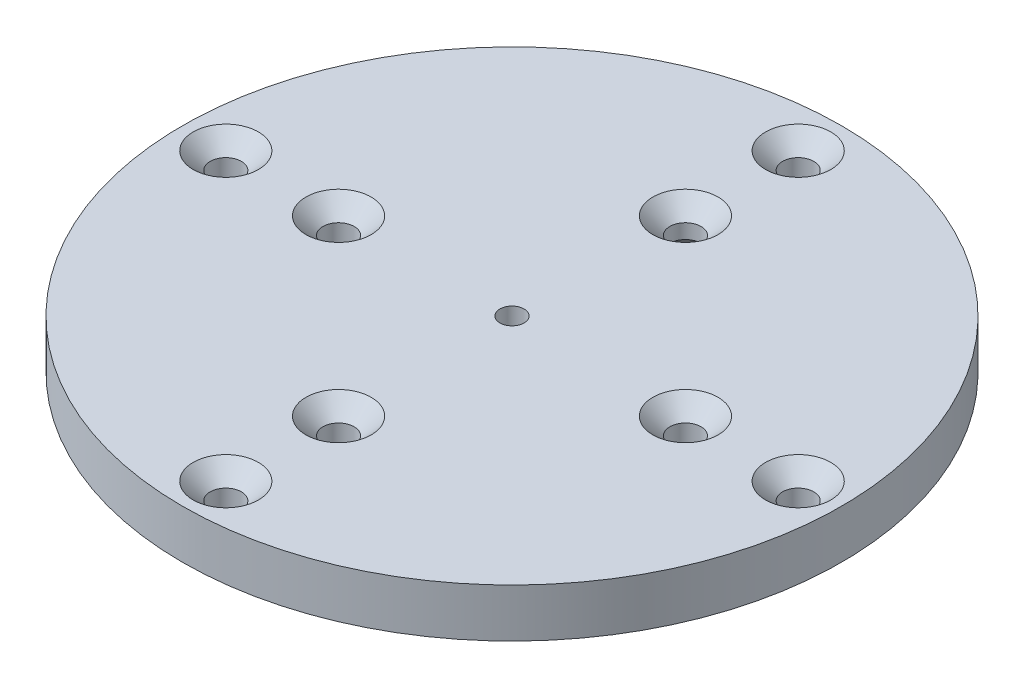
ISO-10303-21;
HEADER;
FILE_DESCRIPTION(('STEP AP214'),'2;1');
FILE_NAME('part.step','',(''),(''),'','','');
FILE_SCHEMA(('AUTOMOTIVE_DESIGN { 1 0 10303 214 1 1 1 1 }'));
ENDSEC;
DATA;
#1=APPLICATION_CONTEXT('core data for automotive mechanical design processes');
#2=APPLICATION_PROTOCOL_DEFINITION('international standard','automotive_design',2000,#1);
#3=PRODUCT_CONTEXT('',#1,'mechanical');
#4=PRODUCT('Part','Part','',(#3));
#5=PRODUCT_RELATED_PRODUCT_CATEGORY('part','',(#4));
#6=PRODUCT_DEFINITION_FORMATION('','',#4);
#7=PRODUCT_DEFINITION_CONTEXT('part definition',#1,'design');
#8=PRODUCT_DEFINITION('design','',#6,#7);
#9=PRODUCT_DEFINITION_SHAPE('','',#8);
#10=(LENGTH_UNIT() NAMED_UNIT(*) SI_UNIT(.MILLI.,.METRE.));
#11=(NAMED_UNIT(*) PLANE_ANGLE_UNIT() SI_UNIT($,.RADIAN.));
#12=(NAMED_UNIT(*) SI_UNIT($,.STERADIAN.) SOLID_ANGLE_UNIT());
#13=UNCERTAINTY_MEASURE_WITH_UNIT(LENGTH_MEASURE(1.E-05),#10,'distance_accuracy_value','');
#14=(GEOMETRIC_REPRESENTATION_CONTEXT(3) GLOBAL_UNCERTAINTY_ASSIGNED_CONTEXT((#13)) GLOBAL_UNIT_ASSIGNED_CONTEXT((#10,
#11,#12)) REPRESENTATION_CONTEXT('',''));
#15=CARTESIAN_POINT('',(0.,0.,0.));
#16=DIRECTION('',(0.,0.,1.));
#17=DIRECTION('',(1.,0.,0.));
#18=AXIS2_PLACEMENT_3D('',#15,#16,#17);
#19=CARTESIAN_POINT('',(0.,7.,0.));
#20=DIRECTION('',(0.,1.,0.));
#21=DIRECTION('',(0.,0.,1.));
#22=AXIS2_PLACEMENT_3D('',#19,#20,#21);
#23=PLANE('',#22);
#24=CARTESIAN_POINT('',(-25.,7.,0.));
#25=DIRECTION('',(0.,1.,0.));
#26=DIRECTION('',(0.,0.,1.));
#27=AXIS2_PLACEMENT_3D('',#24,#25,#26);
#28=CIRCLE('',#27,4.7);
#29=CARTESIAN_POINT('',(-25.,7.,4.7));
#30=VERTEX_POINT('',#29);
#31=EDGE_CURVE('E150',#30,#30,#28,.T.);
#32=ORIENTED_EDGE('',*,*,#31,.F.);
#33=EDGE_LOOP('',(#32));
#34=FACE_BOUND('',#33,.T.);
#35=CARTESIAN_POINT('',(0.,7.,25.));
#36=DIRECTION('',(0.,1.,0.));
#37=DIRECTION('',(0.,0.,1.));
#38=AXIS2_PLACEMENT_3D('',#35,#36,#37);
#39=CIRCLE('',#38,4.7);
#40=CARTESIAN_POINT('',(0.,7.,29.7));
#41=VERTEX_POINT('',#40);
#42=EDGE_CURVE('E138',#41,#41,#39,.T.);
#43=ORIENTED_EDGE('',*,*,#42,.F.);
#44=EDGE_LOOP('',(#43));
#45=FACE_BOUND('',#44,.T.);
#46=CARTESIAN_POINT('',(25.,7.,0.));
#47=DIRECTION('',(0.,1.,0.));
#48=DIRECTION('',(0.,0.,1.));
#49=AXIS2_PLACEMENT_3D('',#46,#47,#48);
#50=CIRCLE('',#49,4.7);
#51=CARTESIAN_POINT('',(25.,7.,4.7));
#52=VERTEX_POINT('',#51);
#53=EDGE_CURVE('E126',#52,#52,#50,.T.);
#54=ORIENTED_EDGE('',*,*,#53,.F.);
#55=EDGE_LOOP('',(#54));
#56=FACE_BOUND('',#55,.T.);
#57=CARTESIAN_POINT('',(0.,7.,-25.));
#58=DIRECTION('',(0.,1.,0.));
#59=DIRECTION('',(0.,0.,1.));
#60=AXIS2_PLACEMENT_3D('',#57,#58,#59);
#61=CIRCLE('',#60,4.7);
#62=CARTESIAN_POINT('',(0.,7.,-20.3));
#63=VERTEX_POINT('',#62);
#64=EDGE_CURVE('E114',#63,#63,#61,.T.);
#65=ORIENTED_EDGE('',*,*,#64,.F.);
#66=EDGE_LOOP('',(#65));
#67=FACE_BOUND('',#66,.T.);
#68=CARTESIAN_POINT('',(0.,7.,0.));
#69=DIRECTION('',(0.,1.,0.));
#70=DIRECTION('',(0.,0.,1.));
#71=AXIS2_PLACEMENT_3D('',#68,#69,#70);
#72=CIRCLE('',#71,1.75);
#73=CARTESIAN_POINT('',(0.,7.,1.75));
#74=VERTEX_POINT('',#73);
#75=EDGE_CURVE('E106',#74,#74,#72,.T.);
#76=ORIENTED_EDGE('',*,*,#75,.F.);
#77=EDGE_LOOP('',(#76));
#78=FACE_BOUND('',#77,.T.);
#79=CARTESIAN_POINT('',(0.,7.,41.25));
#80=DIRECTION('',(0.,1.,0.));
#81=DIRECTION('',(0.,0.,1.));
#82=AXIS2_PLACEMENT_3D('',#79,#80,#81);
#83=CIRCLE('',#82,4.7);
#84=CARTESIAN_POINT('',(0.,7.,45.95));
#85=VERTEX_POINT('',#84);
#86=EDGE_CURVE('E102',#85,#85,#83,.T.);
#87=ORIENTED_EDGE('',*,*,#86,.F.);
#88=EDGE_LOOP('',(#87));
#89=FACE_BOUND('',#88,.T.);
#90=CARTESIAN_POINT('',(41.25,7.,0.));
#91=DIRECTION('',(0.,1.,0.));
#92=DIRECTION('',(0.,0.,1.));
#93=AXIS2_PLACEMENT_3D('',#90,#91,#92);
#94=CIRCLE('',#93,4.7);
#95=CARTESIAN_POINT('',(41.25,7.,4.7));
#96=VERTEX_POINT('',#95);
#97=EDGE_CURVE('E94',#96,#96,#94,.T.);
#98=ORIENTED_EDGE('',*,*,#97,.F.);
#99=EDGE_LOOP('',(#98));
#100=FACE_BOUND('',#99,.T.);
#101=CARTESIAN_POINT('',(0.,7.,-41.25));
#102=DIRECTION('',(0.,1.,0.));
#103=DIRECTION('',(0.,0.,1.));
#104=AXIS2_PLACEMENT_3D('',#101,#102,#103);
#105=CIRCLE('',#104,4.7);
#106=CARTESIAN_POINT('',(0.,7.,-36.55));
#107=VERTEX_POINT('',#106);
#108=EDGE_CURVE('E86',#107,#107,#105,.T.);
#109=ORIENTED_EDGE('',*,*,#108,.F.);
#110=EDGE_LOOP('',(#109));
#111=FACE_BOUND('',#110,.T.);
#112=CARTESIAN_POINT('',(-41.25,7.,0.));
#113=DIRECTION('',(0.,1.,0.));
#114=DIRECTION('',(0.,0.,1.));
#115=AXIS2_PLACEMENT_3D('',#112,#113,#114);
#116=CIRCLE('',#115,4.7);
#117=CARTESIAN_POINT('',(-41.25,7.,4.7));
#118=VERTEX_POINT('',#117);
#119=EDGE_CURVE('E78',#118,#118,#116,.T.);
#120=ORIENTED_EDGE('',*,*,#119,.F.);
#121=EDGE_LOOP('',(#120));
#122=FACE_BOUND('',#121,.T.);
#123=CARTESIAN_POINT('',(0.,7.,0.));
#124=DIRECTION('',(0.,1.,0.));
#125=DIRECTION('',(0.,0.,1.));
#126=AXIS2_PLACEMENT_3D('',#123,#124,#125);
#127=CIRCLE('',#126,47.5);
#128=CARTESIAN_POINT('',(0.,7.,47.5));
#129=VERTEX_POINT('',#128);
#130=EDGE_CURVE('E10',#129,#129,#127,.T.);
#131=ORIENTED_EDGE('',*,*,#130,.T.);
#132=EDGE_LOOP('',(#131));
#133=FACE_BOUND('',#132,.T.);
#134=ADVANCED_FACE('F42',(#34,#45,#56,#67,#78,#89,#100,#111,#122,#133),#23,.T.);
#135=CARTESIAN_POINT('',(0.,0.,0.));
#136=DIRECTION('',(0.,1.,0.));
#137=DIRECTION('',(0.,0.,1.));
#138=AXIS2_PLACEMENT_3D('',#135,#136,#137);
#139=PLANE('',#138);
#140=CARTESIAN_POINT('',(0.,0.,-25.));
#141=DIRECTION('',(0.,-1.,0.));
#142=DIRECTION('',(0.,0.,-1.));
#143=AXIS2_PLACEMENT_3D('',#140,#141,#142);
#144=CIRCLE('',#143,4.7);
#145=CARTESIAN_POINT('',(0.,0.,-29.7));
#146=VERTEX_POINT('',#145);
#147=EDGE_CURVE('E158',#146,#146,#144,.T.);
#148=ORIENTED_EDGE('',*,*,#147,.F.);
#149=EDGE_LOOP('',(#148));
#150=FACE_BOUND('',#149,.T.);
#151=CARTESIAN_POINT('',(-25.,0.,0.));
#152=DIRECTION('',(0.,1.,0.));
#153=DIRECTION('',(0.,0.,1.));
#154=AXIS2_PLACEMENT_3D('',#151,#152,#153);
#155=CIRCLE('',#154,2.25);
#156=CARTESIAN_POINT('',(-25.,0.,2.25));
#157=VERTEX_POINT('',#156);
#158=EDGE_CURVE('E142',#157,#157,#155,.T.);
#159=ORIENTED_EDGE('',*,*,#158,.T.);
#160=EDGE_LOOP('',(#159));
#161=FACE_BOUND('',#160,.T.);
#162=CARTESIAN_POINT('',(0.,0.,25.));
#163=DIRECTION('',(0.,1.,0.));
#164=DIRECTION('',(0.,0.,1.));
#165=AXIS2_PLACEMENT_3D('',#162,#163,#164);
#166=CIRCLE('',#165,2.25);
#167=CARTESIAN_POINT('',(0.,0.,27.25));
#168=VERTEX_POINT('',#167);
#169=EDGE_CURVE('E130',#168,#168,#166,.T.);
#170=ORIENTED_EDGE('',*,*,#169,.T.);
#171=EDGE_LOOP('',(#170));
#172=FACE_BOUND('',#171,.T.);
#173=CARTESIAN_POINT('',(25.,0.,0.));
#174=DIRECTION('',(0.,1.,0.));
#175=DIRECTION('',(0.,0.,1.));
#176=AXIS2_PLACEMENT_3D('',#173,#174,#175);
#177=CIRCLE('',#176,2.25);
#178=CARTESIAN_POINT('',(25.,0.,2.25));
#179=VERTEX_POINT('',#178);
#180=EDGE_CURVE('E118',#179,#179,#177,.T.);
#181=ORIENTED_EDGE('',*,*,#180,.T.);
#182=EDGE_LOOP('',(#181));
#183=FACE_BOUND('',#182,.T.);
#184=CARTESIAN_POINT('',(0.,0.,0.));
#185=DIRECTION('',(0.,1.,0.));
#186=DIRECTION('',(0.,0.,1.));
#187=AXIS2_PLACEMENT_3D('',#184,#185,#186);
#188=CIRCLE('',#187,1.75);
#189=CARTESIAN_POINT('',(0.,0.,1.75));
#190=VERTEX_POINT('',#189);
#191=EDGE_CURVE('E46',#190,#190,#188,.T.);
#192=ORIENTED_EDGE('',*,*,#191,.T.);
#193=EDGE_LOOP('',(#192));
#194=FACE_BOUND('',#193,.T.);
#195=CARTESIAN_POINT('',(0.,0.,-41.25));
#196=DIRECTION('',(0.,1.,0.));
#197=DIRECTION('',(0.,0.,1.));
#198=AXIS2_PLACEMENT_3D('',#195,#196,#197);
#199=CIRCLE('',#198,2.25);
#200=CARTESIAN_POINT('',(0.,0.,-39.));
#201=VERTEX_POINT('',#200);
#202=EDGE_CURVE('E57',#201,#201,#199,.T.);
#203=ORIENTED_EDGE('',*,*,#202,.T.);
#204=EDGE_LOOP('',(#203));
#205=FACE_BOUND('',#204,.T.);
#206=CARTESIAN_POINT('',(41.25,0.,0.));
#207=DIRECTION('',(0.,1.,0.));
#208=DIRECTION('',(0.,0.,1.));
#209=AXIS2_PLACEMENT_3D('',#206,#207,#208);
#210=CIRCLE('',#209,2.25);
#211=CARTESIAN_POINT('',(41.25,0.,2.25));
#212=VERTEX_POINT('',#211);
#213=EDGE_CURVE('E63',#212,#212,#210,.T.);
#214=ORIENTED_EDGE('',*,*,#213,.T.);
#215=EDGE_LOOP('',(#214));
#216=FACE_BOUND('',#215,.T.);
#217=CARTESIAN_POINT('',(0.,0.,41.25));
#218=DIRECTION('',(0.,1.,0.));
#219=DIRECTION('',(0.,0.,-1.));
#220=AXIS2_PLACEMENT_3D('',#217,#218,#219);
#221=CIRCLE('',#220,2.25);
#222=CARTESIAN_POINT('',(0.,0.,39.));
#223=VERTEX_POINT('',#222);
#224=EDGE_CURVE('E59',#223,#223,#221,.T.);
#225=ORIENTED_EDGE('',*,*,#224,.T.);
#226=EDGE_LOOP('',(#225));
#227=FACE_BOUND('',#226,.T.);
#228=CARTESIAN_POINT('',(-41.25,0.,0.));
#229=DIRECTION('',(0.,1.,0.));
#230=DIRECTION('',(0.,0.,-1.));
#231=AXIS2_PLACEMENT_3D('',#228,#229,#230);
#232=CIRCLE('',#231,2.25);
#233=CARTESIAN_POINT('',(-41.25,0.,-2.25));
#234=VERTEX_POINT('',#233);
#235=EDGE_CURVE('E64',#234,#234,#232,.T.);
#236=ORIENTED_EDGE('',*,*,#235,.T.);
#237=EDGE_LOOP('',(#236));
#238=FACE_BOUND('',#237,.T.);
#239=CARTESIAN_POINT('',(0.,0.,0.));
#240=DIRECTION('',(0.,1.,0.));
#241=DIRECTION('',(0.,0.,1.));
#242=AXIS2_PLACEMENT_3D('',#239,#240,#241);
#243=CIRCLE('',#242,47.5);
#244=CARTESIAN_POINT('',(0.,0.,47.5));
#245=VERTEX_POINT('',#244);
#246=EDGE_CURVE('E51',#245,#245,#243,.T.);
#247=ORIENTED_EDGE('',*,*,#246,.F.);
#248=EDGE_LOOP('',(#247));
#249=FACE_BOUND('',#248,.T.);
#250=ADVANCED_FACE('F165',(#150,#161,#172,#183,#194,#205,#216,#227,#238,#249),#139,.F.);
#251=CARTESIAN_POINT('',(0.,7.,0.));
#252=DIRECTION('',(0.,-1.,0.));
#253=DIRECTION('',(0.,0.,-1.));
#254=AXIS2_PLACEMENT_3D('',#251,#252,#253);
#255=CYLINDRICAL_SURFACE('',#254,47.5);
#256=ORIENTED_EDGE('',*,*,#130,.F.);
#257=EDGE_LOOP('',(#256));
#258=FACE_BOUND('',#257,.T.);
#259=ORIENTED_EDGE('',*,*,#246,.T.);
#260=EDGE_LOOP('',(#259));
#261=FACE_BOUND('',#260,.T.);
#262=ADVANCED_FACE('F44',(#258,#261),#255,.T.);
#263=CARTESIAN_POINT('',(-41.25,0.,0.));
#264=DIRECTION('',(0.,1.,0.));
#265=DIRECTION('',(0.,0.,1.));
#266=AXIS2_PLACEMENT_3D('',#263,#264,#265);
#267=CYLINDRICAL_SURFACE('',#266,2.25);
#268=CARTESIAN_POINT('',(-41.25,4.54999999999999,0.));
#269=DIRECTION('',(0.,1.,0.));
#270=DIRECTION('',(0.,0.,1.));
#271=AXIS2_PLACEMENT_3D('',#268,#269,#270);
#272=CIRCLE('',#271,2.24999999999999);
#273=CARTESIAN_POINT('',(-41.25,4.54999999999999,2.24999999999999));
#274=VERTEX_POINT('',#273);
#275=EDGE_CURVE('E71',#274,#274,#272,.T.);
#276=ORIENTED_EDGE('',*,*,#275,.T.);
#277=EDGE_LOOP('',(#276));
#278=FACE_BOUND('',#277,.T.);
#279=ORIENTED_EDGE('',*,*,#235,.F.);
#280=EDGE_LOOP('',(#279));
#281=FACE_BOUND('',#280,.T.);
#282=ADVANCED_FACE('F188',(#278,#281),#267,.F.);
#283=CARTESIAN_POINT('',(0.,0.,41.25));
#284=DIRECTION('',(0.,1.,0.));
#285=DIRECTION('',(0.,0.,1.));
#286=AXIS2_PLACEMENT_3D('',#283,#284,#285);
#287=CYLINDRICAL_SURFACE('',#286,2.25);
#288=CARTESIAN_POINT('',(0.,4.54999999999999,41.25));
#289=DIRECTION('',(0.,1.,0.));
#290=DIRECTION('',(0.,0.,1.));
#291=AXIS2_PLACEMENT_3D('',#288,#289,#290);
#292=CIRCLE('',#291,2.24999999999999);
#293=CARTESIAN_POINT('',(0.,4.54999999999999,43.5));
#294=VERTEX_POINT('',#293);
#295=EDGE_CURVE('E98',#294,#294,#292,.T.);
#296=ORIENTED_EDGE('',*,*,#295,.T.);
#297=EDGE_LOOP('',(#296));
#298=FACE_BOUND('',#297,.T.);
#299=ORIENTED_EDGE('',*,*,#224,.F.);
#300=EDGE_LOOP('',(#299));
#301=FACE_BOUND('',#300,.T.);
#302=ADVANCED_FACE('F193',(#298,#301),#287,.F.);
#303=CARTESIAN_POINT('',(41.25,0.,0.));
#304=DIRECTION('',(0.,1.,0.));
#305=DIRECTION('',(0.,0.,1.));
#306=AXIS2_PLACEMENT_3D('',#303,#304,#305);
#307=CYLINDRICAL_SURFACE('',#306,2.25);
#308=CARTESIAN_POINT('',(41.25,4.54999999999999,0.));
#309=DIRECTION('',(0.,1.,0.));
#310=DIRECTION('',(0.,0.,1.));
#311=AXIS2_PLACEMENT_3D('',#308,#309,#310);
#312=CIRCLE('',#311,2.24999999999999);
#313=CARTESIAN_POINT('',(41.25,4.54999999999999,2.24999999999999));
#314=VERTEX_POINT('',#313);
#315=EDGE_CURVE('E90',#314,#314,#312,.T.);
#316=ORIENTED_EDGE('',*,*,#315,.T.);
#317=EDGE_LOOP('',(#316));
#318=FACE_BOUND('',#317,.T.);
#319=ORIENTED_EDGE('',*,*,#213,.F.);
#320=EDGE_LOOP('',(#319));
#321=FACE_BOUND('',#320,.T.);
#322=ADVANCED_FACE('F207',(#318,#321),#307,.F.);
#323=CARTESIAN_POINT('',(0.,0.,-41.25));
#324=DIRECTION('',(0.,1.,0.));
#325=DIRECTION('',(0.,0.,1.));
#326=AXIS2_PLACEMENT_3D('',#323,#324,#325);
#327=CYLINDRICAL_SURFACE('',#326,2.25);
#328=CARTESIAN_POINT('',(0.,4.54999999999999,-41.25));
#329=DIRECTION('',(0.,1.,0.));
#330=DIRECTION('',(0.,0.,1.));
#331=AXIS2_PLACEMENT_3D('',#328,#329,#330);
#332=CIRCLE('',#331,2.24999999999999);
#333=CARTESIAN_POINT('',(0.,4.54999999999999,-39.));
#334=VERTEX_POINT('',#333);
#335=EDGE_CURVE('E82',#334,#334,#332,.T.);
#336=ORIENTED_EDGE('',*,*,#335,.T.);
#337=EDGE_LOOP('',(#336));
#338=FACE_BOUND('',#337,.T.);
#339=ORIENTED_EDGE('',*,*,#202,.F.);
#340=EDGE_LOOP('',(#339));
#341=FACE_BOUND('',#340,.T.);
#342=ADVANCED_FACE('F210',(#338,#341),#327,.F.);
#343=CARTESIAN_POINT('',(-41.25,7.,0.));
#344=DIRECTION('',(0.,1.,0.));
#345=DIRECTION('',(0.,0.,1.));
#346=AXIS2_PLACEMENT_3D('',#343,#344,#345);
#347=CONICAL_SURFACE('',#346,4.7,0.785398163397448);
#348=ORIENTED_EDGE('',*,*,#275,.F.);
#349=EDGE_LOOP('',(#348));
#350=FACE_BOUND('',#349,.T.);
#351=ORIENTED_EDGE('',*,*,#119,.T.);
#352=EDGE_LOOP('',(#351));
#353=FACE_BOUND('',#352,.T.);
#354=ADVANCED_FACE('F215',(#350,#353),#347,.F.);
#355=CARTESIAN_POINT('',(0.,7.,-41.25));
#356=DIRECTION('',(0.,1.,0.));
#357=DIRECTION('',(0.,0.,1.));
#358=AXIS2_PLACEMENT_3D('',#355,#356,#357);
#359=CONICAL_SURFACE('',#358,4.7,0.785398163397449);
#360=ORIENTED_EDGE('',*,*,#335,.F.);
#361=EDGE_LOOP('',(#360));
#362=FACE_BOUND('',#361,.T.);
#363=ORIENTED_EDGE('',*,*,#108,.T.);
#364=EDGE_LOOP('',(#363));
#365=FACE_BOUND('',#364,.T.);
#366=ADVANCED_FACE('F219',(#362,#365),#359,.F.);
#367=CARTESIAN_POINT('',(41.25,7.,0.));
#368=DIRECTION('',(0.,1.,0.));
#369=DIRECTION('',(0.,0.,1.));
#370=AXIS2_PLACEMENT_3D('',#367,#368,#369);
#371=CONICAL_SURFACE('',#370,4.7,0.785398163397448);
#372=ORIENTED_EDGE('',*,*,#315,.F.);
#373=EDGE_LOOP('',(#372));
#374=FACE_BOUND('',#373,.T.);
#375=ORIENTED_EDGE('',*,*,#97,.T.);
#376=EDGE_LOOP('',(#375));
#377=FACE_BOUND('',#376,.T.);
#378=ADVANCED_FACE('F223',(#374,#377),#371,.F.);
#379=CARTESIAN_POINT('',(0.,7.,41.25));
#380=DIRECTION('',(0.,1.,0.));
#381=DIRECTION('',(0.,0.,1.));
#382=AXIS2_PLACEMENT_3D('',#379,#380,#381);
#383=CONICAL_SURFACE('',#382,4.7,0.785398163397449);
#384=ORIENTED_EDGE('',*,*,#295,.F.);
#385=EDGE_LOOP('',(#384));
#386=FACE_BOUND('',#385,.T.);
#387=ORIENTED_EDGE('',*,*,#86,.T.);
#388=EDGE_LOOP('',(#387));
#389=FACE_BOUND('',#388,.T.);
#390=ADVANCED_FACE('F227',(#386,#389),#383,.F.);
#391=CARTESIAN_POINT('',(0.,-23.,0.));
#392=DIRECTION('',(0.,1.,0.));
#393=DIRECTION('',(0.,0.,1.));
#394=AXIS2_PLACEMENT_3D('',#391,#392,#393);
#395=CYLINDRICAL_SURFACE('',#394,1.75);
#396=ORIENTED_EDGE('',*,*,#75,.T.);
#397=EDGE_LOOP('',(#396));
#398=FACE_BOUND('',#397,.T.);
#399=ORIENTED_EDGE('',*,*,#191,.F.);
#400=EDGE_LOOP('',(#399));
#401=FACE_BOUND('',#400,.T.);
#402=ADVANCED_FACE('F231',(#398,#401),#395,.F.);
#403=CARTESIAN_POINT('',(0.,7.,-25.));
#404=DIRECTION('',(0.,1.,0.));
#405=DIRECTION('',(0.,0.,1.));
#406=AXIS2_PLACEMENT_3D('',#403,#404,#405);
#407=CYLINDRICAL_SURFACE('',#406,2.25);
#408=CARTESIAN_POINT('',(0.,2.45,-25.));
#409=DIRECTION('',(0.,-1.,0.));
#410=DIRECTION('',(0.,0.,-1.));
#411=AXIS2_PLACEMENT_3D('',#408,#409,#410);
#412=CIRCLE('',#411,2.25);
#413=CARTESIAN_POINT('',(0.,2.45,-27.25));
#414=VERTEX_POINT('',#413);
#415=EDGE_CURVE('E154',#414,#414,#412,.T.);
#416=ORIENTED_EDGE('',*,*,#415,.T.);
#417=EDGE_LOOP('',(#416));
#418=FACE_BOUND('',#417,.T.);
#419=CARTESIAN_POINT('',(0.,4.55,-25.));
#420=DIRECTION('',(0.,1.,0.));
#421=DIRECTION('',(0.,0.,1.));
#422=AXIS2_PLACEMENT_3D('',#419,#420,#421);
#423=CIRCLE('',#422,2.25);
#424=CARTESIAN_POINT('',(0.,4.55,-22.75));
#425=VERTEX_POINT('',#424);
#426=EDGE_CURVE('E110',#425,#425,#423,.T.);
#427=ORIENTED_EDGE('',*,*,#426,.T.);
#428=EDGE_LOOP('',(#427));
#429=FACE_BOUND('',#428,.T.);
#430=ADVANCED_FACE('F234',(#418,#429),#407,.F.);
#431=CARTESIAN_POINT('',(0.,7.,-25.));
#432=DIRECTION('',(0.,1.,0.));
#433=DIRECTION('',(0.,0.,1.));
#434=AXIS2_PLACEMENT_3D('',#431,#432,#433);
#435=CONICAL_SURFACE('',#434,4.7,0.785398163397448);
#436=ORIENTED_EDGE('',*,*,#426,.F.);
#437=EDGE_LOOP('',(#436));
#438=FACE_BOUND('',#437,.T.);
#439=ORIENTED_EDGE('',*,*,#64,.T.);
#440=EDGE_LOOP('',(#439));
#441=FACE_BOUND('',#440,.T.);
#442=ADVANCED_FACE('F238',(#438,#441),#435,.F.);
#443=CARTESIAN_POINT('',(25.,7.,0.));
#444=DIRECTION('',(0.,1.,0.));
#445=DIRECTION('',(0.,0.,1.));
#446=AXIS2_PLACEMENT_3D('',#443,#444,#445);
#447=CYLINDRICAL_SURFACE('',#446,2.25);
#448=ORIENTED_EDGE('',*,*,#180,.F.);
#449=EDGE_LOOP('',(#448));
#450=FACE_BOUND('',#449,.T.);
#451=CARTESIAN_POINT('',(25.,4.55,0.));
#452=DIRECTION('',(0.,1.,0.));
#453=DIRECTION('',(0.,0.,1.));
#454=AXIS2_PLACEMENT_3D('',#451,#452,#453);
#455=CIRCLE('',#454,2.25);
#456=CARTESIAN_POINT('',(25.,4.55,2.25));
#457=VERTEX_POINT('',#456);
#458=EDGE_CURVE('E122',#457,#457,#455,.T.);
#459=ORIENTED_EDGE('',*,*,#458,.T.);
#460=EDGE_LOOP('',(#459));
#461=FACE_BOUND('',#460,.T.);
#462=ADVANCED_FACE('F242',(#450,#461),#447,.F.);
#463=CARTESIAN_POINT('',(25.,7.,0.));
#464=DIRECTION('',(0.,1.,0.));
#465=DIRECTION('',(0.,0.,1.));
#466=AXIS2_PLACEMENT_3D('',#463,#464,#465);
#467=CONICAL_SURFACE('',#466,4.7,0.785398163397448);
#468=ORIENTED_EDGE('',*,*,#458,.F.);
#469=EDGE_LOOP('',(#468));
#470=FACE_BOUND('',#469,.T.);
#471=ORIENTED_EDGE('',*,*,#53,.T.);
#472=EDGE_LOOP('',(#471));
#473=FACE_BOUND('',#472,.T.);
#474=ADVANCED_FACE('F246',(#470,#473),#467,.F.);
#475=CARTESIAN_POINT('',(0.,7.,25.));
#476=DIRECTION('',(0.,1.,0.));
#477=DIRECTION('',(0.,0.,1.));
#478=AXIS2_PLACEMENT_3D('',#475,#476,#477);
#479=CYLINDRICAL_SURFACE('',#478,2.25);
#480=ORIENTED_EDGE('',*,*,#169,.F.);
#481=EDGE_LOOP('',(#480));
#482=FACE_BOUND('',#481,.T.);
#483=CARTESIAN_POINT('',(0.,4.55,25.));
#484=DIRECTION('',(0.,1.,0.));
#485=DIRECTION('',(0.,0.,1.));
#486=AXIS2_PLACEMENT_3D('',#483,#484,#485);
#487=CIRCLE('',#486,2.25);
#488=CARTESIAN_POINT('',(0.,4.55,27.25));
#489=VERTEX_POINT('',#488);
#490=EDGE_CURVE('E134',#489,#489,#487,.T.);
#491=ORIENTED_EDGE('',*,*,#490,.T.);
#492=EDGE_LOOP('',(#491));
#493=FACE_BOUND('',#492,.T.);
#494=ADVANCED_FACE('F250',(#482,#493),#479,.F.);
#495=CARTESIAN_POINT('',(0.,7.,25.));
#496=DIRECTION('',(0.,1.,0.));
#497=DIRECTION('',(0.,0.,1.));
#498=AXIS2_PLACEMENT_3D('',#495,#496,#497);
#499=CONICAL_SURFACE('',#498,4.7,0.785398163397448);
#500=ORIENTED_EDGE('',*,*,#490,.F.);
#501=EDGE_LOOP('',(#500));
#502=FACE_BOUND('',#501,.T.);
#503=ORIENTED_EDGE('',*,*,#42,.T.);
#504=EDGE_LOOP('',(#503));
#505=FACE_BOUND('',#504,.T.);
#506=ADVANCED_FACE('F254',(#502,#505),#499,.F.);
#507=CARTESIAN_POINT('',(-25.,7.,0.));
#508=DIRECTION('',(0.,1.,0.));
#509=DIRECTION('',(0.,0.,1.));
#510=AXIS2_PLACEMENT_3D('',#507,#508,#509);
#511=CYLINDRICAL_SURFACE('',#510,2.25);
#512=ORIENTED_EDGE('',*,*,#158,.F.);
#513=EDGE_LOOP('',(#512));
#514=FACE_BOUND('',#513,.T.);
#515=CARTESIAN_POINT('',(-25.,4.55,0.));
#516=DIRECTION('',(0.,1.,0.));
#517=DIRECTION('',(0.,0.,1.));
#518=AXIS2_PLACEMENT_3D('',#515,#516,#517);
#519=CIRCLE('',#518,2.25);
#520=CARTESIAN_POINT('',(-25.,4.55,2.25));
#521=VERTEX_POINT('',#520);
#522=EDGE_CURVE('E146',#521,#521,#519,.T.);
#523=ORIENTED_EDGE('',*,*,#522,.T.);
#524=EDGE_LOOP('',(#523));
#525=FACE_BOUND('',#524,.T.);
#526=ADVANCED_FACE('F258',(#514,#525),#511,.F.);
#527=CARTESIAN_POINT('',(-25.,7.,0.));
#528=DIRECTION('',(0.,1.,0.));
#529=DIRECTION('',(0.,0.,1.));
#530=AXIS2_PLACEMENT_3D('',#527,#528,#529);
#531=CONICAL_SURFACE('',#530,4.7,0.785398163397448);
#532=ORIENTED_EDGE('',*,*,#522,.F.);
#533=EDGE_LOOP('',(#532));
#534=FACE_BOUND('',#533,.T.);
#535=ORIENTED_EDGE('',*,*,#31,.T.);
#536=EDGE_LOOP('',(#535));
#537=FACE_BOUND('',#536,.T.);
#538=ADVANCED_FACE('F262',(#534,#537),#531,.F.);
#539=CARTESIAN_POINT('',(0.,0.,-25.));
#540=DIRECTION('',(0.,-1.,0.));
#541=DIRECTION('',(0.,0.,-1.));
#542=AXIS2_PLACEMENT_3D('',#539,#540,#541);
#543=CONICAL_SURFACE('',#542,4.7,0.785398163397448);
#544=ORIENTED_EDGE('',*,*,#415,.F.);
#545=EDGE_LOOP('',(#544));
#546=FACE_BOUND('',#545,.T.);
#547=ORIENTED_EDGE('',*,*,#147,.T.);
#548=EDGE_LOOP('',(#547));
#549=FACE_BOUND('',#548,.T.);
#550=ADVANCED_FACE('F163',(#546,#549),#543,.F.);
#551=CLOSED_SHELL('',(#134,#250,#262,#282,#302,#322,#342,#354,#366,#378,#390,#402,#430,#442,
#462,#474,#494,#506,#526,#538,#550));
#552=MANIFOLD_SOLID_BREP('B2',#551);
#553=ADVANCED_BREP_SHAPE_REPRESENTATION('',(#18,#552),#14);
#554=SHAPE_DEFINITION_REPRESENTATION(#9,#553);
ENDSEC;
END-ISO-10303-21;
